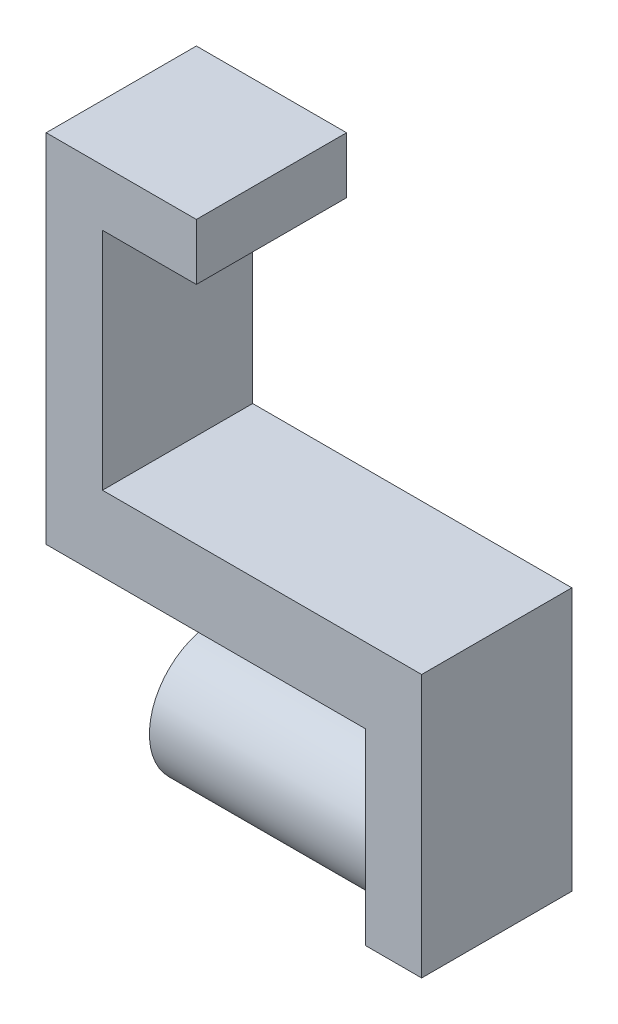
ISO-10303-21;
HEADER;
FILE_DESCRIPTION(('STEP AP214'),'2;1');
FILE_NAME('part.step','',(''),(''),'','','');
FILE_SCHEMA(('AUTOMOTIVE_DESIGN { 1 0 10303 214 1 1 1 1 }'));
ENDSEC;
DATA;
#1=APPLICATION_CONTEXT('core data for automotive mechanical design processes');
#2=APPLICATION_PROTOCOL_DEFINITION('international standard','automotive_design',2000,#1);
#3=PRODUCT_CONTEXT('',#1,'mechanical');
#4=PRODUCT('Part','Part','',(#3));
#5=PRODUCT_RELATED_PRODUCT_CATEGORY('part','',(#4));
#6=PRODUCT_DEFINITION_FORMATION('','',#4);
#7=PRODUCT_DEFINITION_CONTEXT('part definition',#1,'design');
#8=PRODUCT_DEFINITION('design','',#6,#7);
#9=PRODUCT_DEFINITION_SHAPE('','',#8);
#10=(LENGTH_UNIT() NAMED_UNIT(*) SI_UNIT(.MILLI.,.METRE.));
#11=(NAMED_UNIT(*) PLANE_ANGLE_UNIT() SI_UNIT($,.RADIAN.));
#12=(NAMED_UNIT(*) SI_UNIT($,.STERADIAN.) SOLID_ANGLE_UNIT());
#13=UNCERTAINTY_MEASURE_WITH_UNIT(LENGTH_MEASURE(1.E-05),#10,'distance_accuracy_value','');
#14=(GEOMETRIC_REPRESENTATION_CONTEXT(3) GLOBAL_UNCERTAINTY_ASSIGNED_CONTEXT((#13)) GLOBAL_UNIT_ASSIGNED_CONTEXT((#10,
#11,#12)) REPRESENTATION_CONTEXT('',''));
#15=CARTESIAN_POINT('',(0.,0.,0.));
#16=DIRECTION('',(0.,0.,1.));
#17=DIRECTION('',(1.,0.,0.));
#18=AXIS2_PLACEMENT_3D('',#15,#16,#17);
#19=CARTESIAN_POINT('',(-38.1,0.,0.));
#20=DIRECTION('',(1.,0.,0.));
#21=DIRECTION('',(0.,0.,-1.));
#22=AXIS2_PLACEMENT_3D('',#19,#20,#21);
#23=CYLINDRICAL_SURFACE('',#22,11.1125);
#24=CARTESIAN_POINT('',(-38.1,0.,0.));
#25=DIRECTION('',(1.,0.,0.));
#26=DIRECTION('',(0.,0.,-1.));
#27=AXIS2_PLACEMENT_3D('',#24,#25,#26);
#28=CIRCLE('',#27,11.1125);
#29=CARTESIAN_POINT('',(-38.1,0.,-11.1125));
#30=VERTEX_POINT('',#29);
#31=EDGE_CURVE('E233',#30,#30,#28,.T.);
#32=ORIENTED_EDGE('',*,*,#31,.T.);
#33=EDGE_LOOP('',(#32));
#34=FACE_BOUND('',#33,.T.);
#35=CARTESIAN_POINT('',(0.,0.,0.));
#36=DIRECTION('',(1.,0.,0.));
#37=DIRECTION('',(0.,0.,-1.));
#38=AXIS2_PLACEMENT_3D('',#35,#36,#37);
#39=CIRCLE('',#38,11.1125);
#40=CARTESIAN_POINT('',(0.,-11.1125,0.));
#41=VERTEX_POINT('',#40);
#42=EDGE_CURVE('E230',#41,#41,#39,.T.);
#43=ORIENTED_EDGE('',*,*,#42,.F.);
#44=EDGE_LOOP('',(#43));
#45=FACE_BOUND('',#44,.T.);
#46=ADVANCED_FACE('F44',(#34,#45),#23,.T.);
#47=CARTESIAN_POINT('',(-38.1,0.,0.));
#48=DIRECTION('',(1.,0.,0.));
#49=DIRECTION('',(0.,0.,-1.));
#50=AXIS2_PLACEMENT_3D('',#47,#48,#49);
#51=PLANE('',#50);
#52=ORIENTED_EDGE('',*,*,#31,.F.);
#53=EDGE_LOOP('',(#52));
#54=FACE_BOUND('',#53,.T.);
#55=ADVANCED_FACE('F269',(#54),#51,.F.);
#56=CARTESIAN_POINT('',(0.,-11.1125,-12.7));
#57=DIRECTION('',(-1.,0.,0.));
#58=DIRECTION('',(0.,0.,1.));
#59=AXIS2_PLACEMENT_3D('',#56,#57,#58);
#60=PLANE('',#59);
#61=DIRECTION('',(0.,0.,1.));
#62=VECTOR('',#61,1.);
#63=CARTESIAN_POINT('',(0.,-11.1125,-12.7));
#64=LINE('',#63,#62);
#65=CARTESIAN_POINT('',(0.,-11.1125,-12.7));
#66=VERTEX_POINT('',#65);
#67=EDGE_CURVE('E232',#66,#41,#64,.T.);
#68=ORIENTED_EDGE('',*,*,#67,.T.);
#69=ORIENTED_EDGE('',*,*,#42,.T.);
#70=CARTESIAN_POINT('',(0.,-11.1125,12.7));
#71=VERTEX_POINT('',#70);
#72=EDGE_CURVE('E225',#41,#71,#64,.T.);
#73=ORIENTED_EDGE('',*,*,#72,.T.);
#74=DIRECTION('',(0.,-1.,0.));
#75=VECTOR('',#74,1.);
#76=CARTESIAN_POINT('',(0.,-11.1125,12.7));
#77=LINE('',#76,#75);
#78=CARTESIAN_POINT('',(0.,20.6375,12.7));
#79=VERTEX_POINT('',#78);
#80=EDGE_CURVE('E197',#79,#71,#77,.T.);
#81=ORIENTED_EDGE('',*,*,#80,.F.);
#82=DIRECTION('',(0.,0.,1.));
#83=VECTOR('',#82,1.);
#84=CARTESIAN_POINT('',(0.,20.6375,-12.7));
#85=LINE('',#84,#83);
#86=CARTESIAN_POINT('',(0.,20.6375,-12.7));
#87=VERTEX_POINT('',#86);
#88=EDGE_CURVE('E224',#87,#79,#85,.T.);
#89=ORIENTED_EDGE('',*,*,#88,.F.);
#90=DIRECTION('',(0.,-1.,0.));
#91=VECTOR('',#90,1.);
#92=CARTESIAN_POINT('',(0.,-11.1125,-12.7));
#93=LINE('',#92,#91);
#94=EDGE_CURVE('E211',#87,#66,#93,.T.);
#95=ORIENTED_EDGE('',*,*,#94,.T.);
#96=EDGE_LOOP('',(#68,#69,#73,#81,#89,#95));
#97=FACE_BOUND('',#96,.T.);
#98=ADVANCED_FACE('F265',(#97),#60,.T.);
#99=CARTESIAN_POINT('',(9.525,-11.1125,-12.7));
#100=DIRECTION('',(1.,0.,0.));
#101=DIRECTION('',(0.,0.,-1.));
#102=AXIS2_PLACEMENT_3D('',#99,#100,#101);
#103=PLANE('',#102);
#104=DIRECTION('',(0.,1.,0.));
#105=VECTOR('',#104,1.);
#106=CARTESIAN_POINT('',(9.525,-11.1125,-12.7));
#107=LINE('',#106,#105);
#108=CARTESIAN_POINT('',(9.525,-11.1125,-12.7));
#109=VERTEX_POINT('',#108);
#110=CARTESIAN_POINT('',(9.525,33.3375,-12.7));
#111=VERTEX_POINT('',#110);
#112=EDGE_CURVE('E218',#109,#111,#107,.T.);
#113=ORIENTED_EDGE('',*,*,#112,.T.);
#114=DIRECTION('',(0.,0.,1.));
#115=VECTOR('',#114,1.);
#116=CARTESIAN_POINT('',(9.525,33.3375,-12.7));
#117=LINE('',#116,#115);
#118=CARTESIAN_POINT('',(9.525,33.3375,12.7));
#119=VERTEX_POINT('',#118);
#120=EDGE_CURVE('E194',#111,#119,#117,.T.);
#121=ORIENTED_EDGE('',*,*,#120,.T.);
#122=DIRECTION('',(0.,1.,0.));
#123=VECTOR('',#122,1.);
#124=CARTESIAN_POINT('',(9.525,-11.1125,12.7));
#125=LINE('',#124,#123);
#126=CARTESIAN_POINT('',(9.525,-11.1125,12.7));
#127=VERTEX_POINT('',#126);
#128=EDGE_CURVE('E208',#127,#119,#125,.T.);
#129=ORIENTED_EDGE('',*,*,#128,.F.);
#130=DIRECTION('',(0.,0.,1.));
#131=VECTOR('',#130,1.);
#132=CARTESIAN_POINT('',(9.525,-11.1125,-12.7));
#133=LINE('',#132,#131);
#134=EDGE_CURVE('E227',#109,#127,#133,.T.);
#135=ORIENTED_EDGE('',*,*,#134,.F.);
#136=EDGE_LOOP('',(#113,#121,#129,#135));
#137=FACE_BOUND('',#136,.T.);
#138=ADVANCED_FACE('F281',(#137),#103,.T.);
#139=CARTESIAN_POINT('',(0.,-11.1125,-12.7));
#140=DIRECTION('',(0.,-1.,0.));
#141=DIRECTION('',(0.,0.,-1.));
#142=AXIS2_PLACEMENT_3D('',#139,#140,#141);
#143=PLANE('',#142);
#144=ORIENTED_EDGE('',*,*,#134,.T.);
#145=DIRECTION('',(1.,0.,0.));
#146=VECTOR('',#145,1.);
#147=CARTESIAN_POINT('',(0.,-11.1125,12.7));
#148=LINE('',#147,#146);
#149=EDGE_CURVE('E204',#71,#127,#148,.T.);
#150=ORIENTED_EDGE('',*,*,#149,.F.);
#151=ORIENTED_EDGE('',*,*,#72,.F.);
#152=ORIENTED_EDGE('',*,*,#67,.F.);
#153=DIRECTION('',(1.,0.,0.));
#154=VECTOR('',#153,1.);
#155=CARTESIAN_POINT('',(0.,-11.1125,-12.7));
#156=LINE('',#155,#154);
#157=EDGE_CURVE('E214',#66,#109,#156,.T.);
#158=ORIENTED_EDGE('',*,*,#157,.T.);
#159=EDGE_LOOP('',(#144,#150,#151,#152,#158));
#160=FACE_BOUND('',#159,.T.);
#161=ADVANCED_FACE('F264',(#160),#143,.T.);
#162=CARTESIAN_POINT('',(0.,0.,-12.7));
#163=DIRECTION('',(0.,0.,-1.));
#164=DIRECTION('',(-1.,0.,0.));
#165=AXIS2_PLACEMENT_3D('',#162,#163,#164);
#166=PLANE('',#165);
#167=DIRECTION('',(-1.,0.,0.));
#168=VECTOR('',#167,1.);
#169=CARTESIAN_POINT('',(-53.975,80.9371,-12.7));
#170=LINE('',#169,#168);
#171=CARTESIAN_POINT('',(-28.575,80.9371,-12.7));
#172=VERTEX_POINT('',#171);
#173=CARTESIAN_POINT('',(-53.975,80.9371,-12.7));
#174=VERTEX_POINT('',#173);
#175=EDGE_CURVE('E167',#172,#174,#170,.T.);
#176=ORIENTED_EDGE('',*,*,#175,.F.);
#177=DIRECTION('',(0.,1.,0.));
#178=VECTOR('',#177,1.);
#179=CARTESIAN_POINT('',(-28.575,71.4121,-12.7));
#180=LINE('',#179,#178);
#181=CARTESIAN_POINT('',(-28.575,71.4121,-12.7));
#182=VERTEX_POINT('',#181);
#183=EDGE_CURVE('E145',#182,#172,#180,.T.);
#184=ORIENTED_EDGE('',*,*,#183,.F.);
#185=DIRECTION('',(1.,0.,0.));
#186=VECTOR('',#185,1.);
#187=CARTESIAN_POINT('',(-53.975,71.4121,-12.7));
#188=LINE('',#187,#186);
#189=CARTESIAN_POINT('',(-44.45,71.4121,-12.7));
#190=VERTEX_POINT('',#189);
#191=EDGE_CURVE('E139',#190,#182,#188,.T.);
#192=ORIENTED_EDGE('',*,*,#191,.F.);
#193=DIRECTION('',(0.,1.,0.));
#194=VECTOR('',#193,1.);
#195=CARTESIAN_POINT('',(-44.45,20.6375,-12.7));
#196=LINE('',#195,#194);
#197=CARTESIAN_POINT('',(-44.45,33.3375,-12.7));
#198=VERTEX_POINT('',#197);
#199=EDGE_CURVE('E162',#198,#190,#196,.T.);
#200=ORIENTED_EDGE('',*,*,#199,.F.);
#201=DIRECTION('',(-1.,0.,0.));
#202=VECTOR('',#201,1.);
#203=CARTESIAN_POINT('',(-53.975,33.3375,-12.7));
#204=LINE('',#203,#202);
#205=EDGE_CURVE('E188',#111,#198,#204,.T.);
#206=ORIENTED_EDGE('',*,*,#205,.F.);
#207=ORIENTED_EDGE('',*,*,#112,.F.);
#208=ORIENTED_EDGE('',*,*,#157,.F.);
#209=ORIENTED_EDGE('',*,*,#94,.F.);
#210=DIRECTION('',(1.,0.,0.));
#211=VECTOR('',#210,1.);
#212=CARTESIAN_POINT('',(-53.975,20.6375,-12.7));
#213=LINE('',#212,#211);
#214=CARTESIAN_POINT('',(-53.975,20.6375,-12.7));
#215=VERTEX_POINT('',#214);
#216=EDGE_CURVE('E186',#215,#87,#213,.T.);
#217=ORIENTED_EDGE('',*,*,#216,.F.);
#218=DIRECTION('',(0.,-1.,0.));
#219=VECTOR('',#218,1.);
#220=CARTESIAN_POINT('',(-53.975,20.6375,-12.7));
#221=LINE('',#220,#219);
#222=EDGE_CURVE('E181',#174,#215,#221,.T.);
#223=ORIENTED_EDGE('',*,*,#222,.F.);
#224=EDGE_LOOP('',(#176,#184,#192,#200,#206,#207,#208,#209,#217,#223));
#225=FACE_BOUND('',#224,.T.);
#226=ADVANCED_FACE('F247',(#225),#166,.T.);
#227=CARTESIAN_POINT('',(0.,0.,12.7));
#228=DIRECTION('',(0.,0.,-1.));
#229=DIRECTION('',(-1.,0.,0.));
#230=AXIS2_PLACEMENT_3D('',#227,#228,#229);
#231=PLANE('',#230);
#232=DIRECTION('',(0.,-1.,0.));
#233=VECTOR('',#232,1.);
#234=CARTESIAN_POINT('',(-53.975,20.6375,12.7));
#235=LINE('',#234,#233);
#236=CARTESIAN_POINT('',(-53.975,80.9371,12.7));
#237=VERTEX_POINT('',#236);
#238=CARTESIAN_POINT('',(-53.975,20.6375,12.7));
#239=VERTEX_POINT('',#238);
#240=EDGE_CURVE('E173',#237,#239,#235,.T.);
#241=ORIENTED_EDGE('',*,*,#240,.T.);
#242=DIRECTION('',(1.,0.,0.));
#243=VECTOR('',#242,1.);
#244=CARTESIAN_POINT('',(-53.975,20.6375,12.7));
#245=LINE('',#244,#243);
#246=EDGE_CURVE('E180',#239,#79,#245,.T.);
#247=ORIENTED_EDGE('',*,*,#246,.T.);
#248=ORIENTED_EDGE('',*,*,#80,.T.);
#249=ORIENTED_EDGE('',*,*,#149,.T.);
#250=ORIENTED_EDGE('',*,*,#128,.T.);
#251=DIRECTION('',(-1.,0.,0.));
#252=VECTOR('',#251,1.);
#253=CARTESIAN_POINT('',(-53.975,33.3375,12.7));
#254=LINE('',#253,#252);
#255=CARTESIAN_POINT('',(-44.45,33.3375,12.7));
#256=VERTEX_POINT('',#255);
#257=EDGE_CURVE('E178',#119,#256,#254,.T.);
#258=ORIENTED_EDGE('',*,*,#257,.T.);
#259=DIRECTION('',(0.,1.,0.));
#260=VECTOR('',#259,1.);
#261=CARTESIAN_POINT('',(-44.45,20.6375,12.7));
#262=LINE('',#261,#260);
#263=CARTESIAN_POINT('',(-44.45,71.4121,12.7));
#264=VERTEX_POINT('',#263);
#265=EDGE_CURVE('E128',#256,#264,#262,.T.);
#266=ORIENTED_EDGE('',*,*,#265,.T.);
#267=DIRECTION('',(1.,0.,0.));
#268=VECTOR('',#267,1.);
#269=CARTESIAN_POINT('',(-53.975,71.4121,12.7));
#270=LINE('',#269,#268);
#271=CARTESIAN_POINT('',(-28.575,71.4121,12.7));
#272=VERTEX_POINT('',#271);
#273=EDGE_CURVE('E121',#264,#272,#270,.T.);
#274=ORIENTED_EDGE('',*,*,#273,.T.);
#275=DIRECTION('',(0.,1.,0.));
#276=VECTOR('',#275,1.);
#277=CARTESIAN_POINT('',(-28.575,71.4121,12.7));
#278=LINE('',#277,#276);
#279=CARTESIAN_POINT('',(-28.575,80.9371,12.7));
#280=VERTEX_POINT('',#279);
#281=EDGE_CURVE('E129',#272,#280,#278,.T.);
#282=ORIENTED_EDGE('',*,*,#281,.T.);
#283=DIRECTION('',(-1.,0.,0.));
#284=VECTOR('',#283,1.);
#285=CARTESIAN_POINT('',(-53.975,80.9371,12.7));
#286=LINE('',#285,#284);
#287=EDGE_CURVE('E159',#280,#237,#286,.T.);
#288=ORIENTED_EDGE('',*,*,#287,.T.);
#289=EDGE_LOOP('',(#241,#247,#248,#249,#250,#258,#266,#274,#282,#288));
#290=FACE_BOUND('',#289,.T.);
#291=ADVANCED_FACE('F127',(#290),#231,.F.);
#292=CARTESIAN_POINT('',(-53.975,20.6375,-12.7));
#293=DIRECTION('',(-1.,0.,0.));
#294=DIRECTION('',(0.,0.,1.));
#295=AXIS2_PLACEMENT_3D('',#292,#293,#294);
#296=PLANE('',#295);
#297=DIRECTION('',(0.,0.,1.));
#298=VECTOR('',#297,1.);
#299=CARTESIAN_POINT('',(-53.975,20.6375,-12.7));
#300=LINE('',#299,#298);
#301=EDGE_CURVE('E195',#215,#239,#300,.T.);
#302=ORIENTED_EDGE('',*,*,#301,.T.);
#303=ORIENTED_EDGE('',*,*,#240,.F.);
#304=DIRECTION('',(0.,0.,1.));
#305=VECTOR('',#304,1.);
#306=CARTESIAN_POINT('',(-53.975,80.9371,-12.7));
#307=LINE('',#306,#305);
#308=EDGE_CURVE('E168',#174,#237,#307,.T.);
#309=ORIENTED_EDGE('',*,*,#308,.F.);
#310=ORIENTED_EDGE('',*,*,#222,.T.);
#311=EDGE_LOOP('',(#302,#303,#309,#310));
#312=FACE_BOUND('',#311,.T.);
#313=ADVANCED_FACE('F258',(#312),#296,.T.);
#314=CARTESIAN_POINT('',(-53.975,33.3375,-12.7));
#315=DIRECTION('',(0.,1.,0.));
#316=DIRECTION('',(0.,0.,1.));
#317=AXIS2_PLACEMENT_3D('',#314,#315,#316);
#318=PLANE('',#317);
#319=DIRECTION('',(0.,0.,-1.));
#320=VECTOR('',#319,1.);
#321=CARTESIAN_POINT('',(-44.45,33.3375,-12.7));
#322=LINE('',#321,#320);
#323=EDGE_CURVE('E52',#256,#198,#322,.T.);
#324=ORIENTED_EDGE('',*,*,#323,.F.);
#325=ORIENTED_EDGE('',*,*,#257,.F.);
#326=ORIENTED_EDGE('',*,*,#120,.F.);
#327=ORIENTED_EDGE('',*,*,#205,.T.);
#328=EDGE_LOOP('',(#324,#325,#326,#327));
#329=FACE_BOUND('',#328,.T.);
#330=ADVANCED_FACE('F294',(#329),#318,.T.);
#331=CARTESIAN_POINT('',(-53.975,20.6375,-12.7));
#332=DIRECTION('',(0.,-1.,0.));
#333=DIRECTION('',(0.,0.,-1.));
#334=AXIS2_PLACEMENT_3D('',#331,#332,#333);
#335=PLANE('',#334);
#336=ORIENTED_EDGE('',*,*,#88,.T.);
#337=ORIENTED_EDGE('',*,*,#246,.F.);
#338=ORIENTED_EDGE('',*,*,#301,.F.);
#339=ORIENTED_EDGE('',*,*,#216,.T.);
#340=EDGE_LOOP('',(#336,#337,#338,#339));
#341=FACE_BOUND('',#340,.T.);
#342=ADVANCED_FACE('F256',(#341),#335,.T.);
#343=CARTESIAN_POINT('',(-53.975,80.9371,-12.7));
#344=DIRECTION('',(0.,1.,0.));
#345=DIRECTION('',(0.,0.,1.));
#346=AXIS2_PLACEMENT_3D('',#343,#344,#345);
#347=PLANE('',#346);
#348=ORIENTED_EDGE('',*,*,#308,.T.);
#349=ORIENTED_EDGE('',*,*,#287,.F.);
#350=DIRECTION('',(0.,0.,1.));
#351=VECTOR('',#350,1.);
#352=CARTESIAN_POINT('',(-28.575,80.9371,-12.7));
#353=LINE('',#352,#351);
#354=EDGE_CURVE('E141',#172,#280,#353,.T.);
#355=ORIENTED_EDGE('',*,*,#354,.F.);
#356=ORIENTED_EDGE('',*,*,#175,.T.);
#357=EDGE_LOOP('',(#348,#349,#355,#356));
#358=FACE_BOUND('',#357,.T.);
#359=ADVANCED_FACE('F253',(#358),#347,.T.);
#360=CARTESIAN_POINT('',(-44.45,20.6375,-12.7));
#361=DIRECTION('',(1.,0.,0.));
#362=DIRECTION('',(0.,0.,-1.));
#363=AXIS2_PLACEMENT_3D('',#360,#361,#362);
#364=PLANE('',#363);
#365=DIRECTION('',(0.,0.,-1.));
#366=VECTOR('',#365,1.);
#367=CARTESIAN_POINT('',(-44.45,71.4121,-12.7));
#368=LINE('',#367,#366);
#369=EDGE_CURVE('E11',#264,#190,#368,.T.);
#370=ORIENTED_EDGE('',*,*,#369,.F.);
#371=ORIENTED_EDGE('',*,*,#265,.F.);
#372=ORIENTED_EDGE('',*,*,#323,.T.);
#373=ORIENTED_EDGE('',*,*,#199,.T.);
#374=EDGE_LOOP('',(#370,#371,#372,#373));
#375=FACE_BOUND('',#374,.T.);
#376=ADVANCED_FACE('F242',(#375),#364,.T.);
#377=CARTESIAN_POINT('',(-28.575,71.4121,-12.7));
#378=DIRECTION('',(1.,0.,0.));
#379=DIRECTION('',(0.,0.,-1.));
#380=AXIS2_PLACEMENT_3D('',#377,#378,#379);
#381=PLANE('',#380);
#382=ORIENTED_EDGE('',*,*,#354,.T.);
#383=ORIENTED_EDGE('',*,*,#281,.F.);
#384=DIRECTION('',(0.,0.,1.));
#385=VECTOR('',#384,1.);
#386=CARTESIAN_POINT('',(-28.575,71.4121,-12.7));
#387=LINE('',#386,#385);
#388=EDGE_CURVE('E134',#182,#272,#387,.T.);
#389=ORIENTED_EDGE('',*,*,#388,.F.);
#390=ORIENTED_EDGE('',*,*,#183,.T.);
#391=EDGE_LOOP('',(#382,#383,#389,#390));
#392=FACE_BOUND('',#391,.T.);
#393=ADVANCED_FACE('F150',(#392),#381,.T.);
#394=CARTESIAN_POINT('',(-53.975,71.4121,-12.7));
#395=DIRECTION('',(0.,-1.,0.));
#396=DIRECTION('',(0.,0.,-1.));
#397=AXIS2_PLACEMENT_3D('',#394,#395,#396);
#398=PLANE('',#397);
#399=ORIENTED_EDGE('',*,*,#273,.F.);
#400=ORIENTED_EDGE('',*,*,#369,.T.);
#401=ORIENTED_EDGE('',*,*,#191,.T.);
#402=ORIENTED_EDGE('',*,*,#388,.T.);
#403=EDGE_LOOP('',(#399,#400,#401,#402));
#404=FACE_BOUND('',#403,.T.);
#405=ADVANCED_FACE('F137',(#404),#398,.T.);
#406=CLOSED_SHELL('',(#46,#55,#98,#138,#161,#226,#291,#313,#330,#342,#359,#376,#393,#405));
#407=MANIFOLD_SOLID_BREP('B2',#406);
#408=ADVANCED_BREP_SHAPE_REPRESENTATION('',(#18,#407),#14);
#409=SHAPE_DEFINITION_REPRESENTATION(#9,#408);
ENDSEC;
END-ISO-10303-21;
